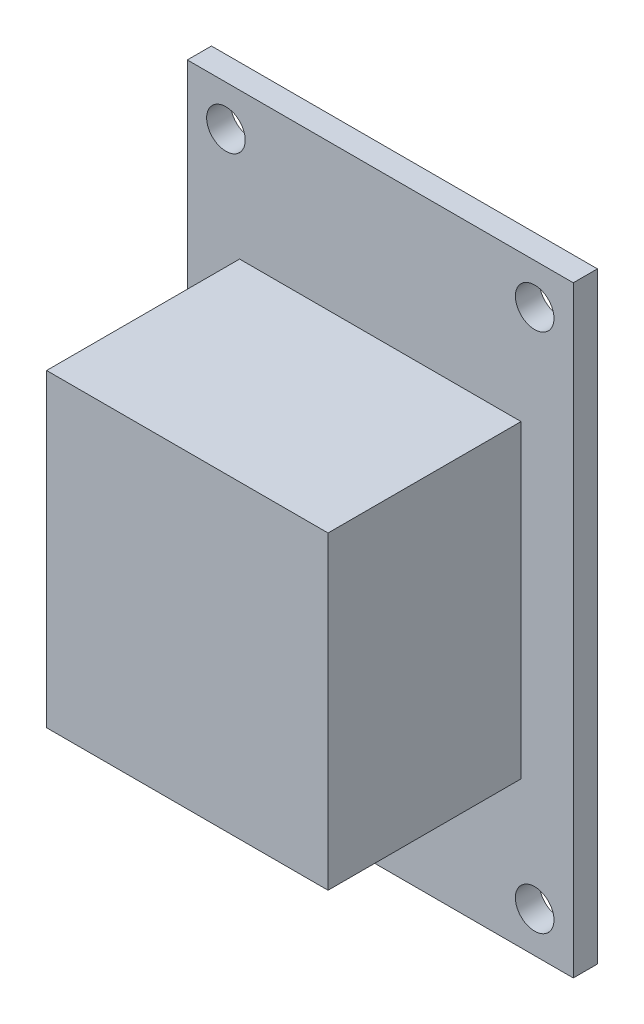
ISO-10303-21;
HEADER;
FILE_DESCRIPTION(('STEP AP214'),'2;1');
FILE_NAME('part.step','',(''),(''),'','','');
FILE_SCHEMA(('AUTOMOTIVE_DESIGN { 1 0 10303 214 1 1 1 1 }'));
ENDSEC;
DATA;
#1=APPLICATION_CONTEXT('core data for automotive mechanical design processes');
#2=APPLICATION_PROTOCOL_DEFINITION('international standard','automotive_design',2000,#1);
#3=PRODUCT_CONTEXT('',#1,'mechanical');
#4=PRODUCT('Part','Part','',(#3));
#5=PRODUCT_RELATED_PRODUCT_CATEGORY('part','',(#4));
#6=PRODUCT_DEFINITION_FORMATION('','',#4);
#7=PRODUCT_DEFINITION_CONTEXT('part definition',#1,'design');
#8=PRODUCT_DEFINITION('design','',#6,#7);
#9=PRODUCT_DEFINITION_SHAPE('','',#8);
#10=(LENGTH_UNIT() NAMED_UNIT(*) SI_UNIT(.MILLI.,.METRE.));
#11=(NAMED_UNIT(*) PLANE_ANGLE_UNIT() SI_UNIT($,.RADIAN.));
#12=(NAMED_UNIT(*) SI_UNIT($,.STERADIAN.) SOLID_ANGLE_UNIT());
#13=UNCERTAINTY_MEASURE_WITH_UNIT(LENGTH_MEASURE(1.E-05),#10,'distance_accuracy_value','');
#14=(GEOMETRIC_REPRESENTATION_CONTEXT(3) GLOBAL_UNCERTAINTY_ASSIGNED_CONTEXT((#13)) GLOBAL_UNIT_ASSIGNED_CONTEXT((#10,
#11,#12)) REPRESENTATION_CONTEXT('',''));
#15=CARTESIAN_POINT('',(0.,0.,0.));
#16=DIRECTION('',(0.,0.,1.));
#17=DIRECTION('',(1.,0.,0.));
#18=AXIS2_PLACEMENT_3D('',#15,#16,#17);
#19=CARTESIAN_POINT('',(12.7,19.812,1.5875));
#20=DIRECTION('',(-1.,0.,0.));
#21=DIRECTION('',(0.,-1.,0.));
#22=AXIS2_PLACEMENT_3D('',#19,#20,#21);
#23=PLANE('',#22);
#24=DIRECTION('',(0.,1.,0.));
#25=VECTOR('',#24,1.);
#26=CARTESIAN_POINT('',(12.7,19.812,0.));
#27=LINE('',#26,#25);
#28=CARTESIAN_POINT('',(12.7,-19.812,0.));
#29=VERTEX_POINT('',#28);
#30=CARTESIAN_POINT('',(12.7,19.812,0.));
#31=VERTEX_POINT('',#30);
#32=EDGE_CURVE('E126',#29,#31,#27,.T.);
#33=ORIENTED_EDGE('',*,*,#32,.T.);
#34=DIRECTION('',(0.,0.,-1.));
#35=VECTOR('',#34,1.);
#36=CARTESIAN_POINT('',(12.7,19.812,1.5875));
#37=LINE('',#36,#35);
#38=CARTESIAN_POINT('',(12.7,19.812,1.5875));
#39=VERTEX_POINT('',#38);
#40=EDGE_CURVE('E11',#39,#31,#37,.T.);
#41=ORIENTED_EDGE('',*,*,#40,.F.);
#42=DIRECTION('',(0.,1.,0.));
#43=VECTOR('',#42,1.);
#44=CARTESIAN_POINT('',(12.7,19.812,1.5875));
#45=LINE('',#44,#43);
#46=CARTESIAN_POINT('',(12.7,-19.812,1.5875));
#47=VERTEX_POINT('',#46);
#48=EDGE_CURVE('E137',#47,#39,#45,.T.);
#49=ORIENTED_EDGE('',*,*,#48,.F.);
#50=DIRECTION('',(0.,0.,-1.));
#51=VECTOR('',#50,1.);
#52=CARTESIAN_POINT('',(12.7,-19.812,1.5875));
#53=LINE('',#52,#51);
#54=EDGE_CURVE('E150',#47,#29,#53,.T.);
#55=ORIENTED_EDGE('',*,*,#54,.T.);
#56=EDGE_LOOP('',(#33,#41,#49,#55));
#57=FACE_BOUND('',#56,.T.);
#58=ADVANCED_FACE('F38',(#57),#23,.F.);
#59=CARTESIAN_POINT('',(-12.7,19.812,1.5875));
#60=DIRECTION('',(0.,-1.,0.));
#61=DIRECTION('',(0.,0.,-1.));
#62=AXIS2_PLACEMENT_3D('',#59,#60,#61);
#63=PLANE('',#62);
#64=DIRECTION('',(-1.,0.,0.));
#65=VECTOR('',#64,1.);
#66=CARTESIAN_POINT('',(-12.7,19.812,0.));
#67=LINE('',#66,#65);
#68=CARTESIAN_POINT('',(-12.7,19.812,0.));
#69=VERTEX_POINT('',#68);
#70=EDGE_CURVE('E131',#31,#69,#67,.T.);
#71=ORIENTED_EDGE('',*,*,#70,.T.);
#72=DIRECTION('',(0.,0.,-1.));
#73=VECTOR('',#72,1.);
#74=CARTESIAN_POINT('',(-12.7,19.812,1.5875));
#75=LINE('',#74,#73);
#76=CARTESIAN_POINT('',(-12.7,19.812,1.5875));
#77=VERTEX_POINT('',#76);
#78=EDGE_CURVE('E46',#77,#69,#75,.T.);
#79=ORIENTED_EDGE('',*,*,#78,.F.);
#80=DIRECTION('',(-1.,0.,0.));
#81=VECTOR('',#80,1.);
#82=CARTESIAN_POINT('',(-12.7,19.812,1.5875));
#83=LINE('',#82,#81);
#84=EDGE_CURVE('E141',#39,#77,#83,.T.);
#85=ORIENTED_EDGE('',*,*,#84,.F.);
#86=ORIENTED_EDGE('',*,*,#40,.T.);
#87=EDGE_LOOP('',(#71,#79,#85,#86));
#88=FACE_BOUND('',#87,.T.);
#89=ADVANCED_FACE('F187',(#88),#63,.F.);
#90=CARTESIAN_POINT('',(-12.7,19.812,1.5875));
#91=DIRECTION('',(1.,0.,0.));
#92=DIRECTION('',(0.,1.,0.));
#93=AXIS2_PLACEMENT_3D('',#90,#91,#92);
#94=PLANE('',#93);
#95=DIRECTION('',(0.,-1.,0.));
#96=VECTOR('',#95,1.);
#97=CARTESIAN_POINT('',(-12.7,19.812,0.));
#98=LINE('',#97,#96);
#99=CARTESIAN_POINT('',(-12.7,-19.812,0.));
#100=VERTEX_POINT('',#99);
#101=EDGE_CURVE('E154',#69,#100,#98,.T.);
#102=ORIENTED_EDGE('',*,*,#101,.T.);
#103=DIRECTION('',(0.,0.,-1.));
#104=VECTOR('',#103,1.);
#105=CARTESIAN_POINT('',(-12.7,-19.812,1.5875));
#106=LINE('',#105,#104);
#107=CARTESIAN_POINT('',(-12.7,-19.812,1.5875));
#108=VERTEX_POINT('',#107);
#109=EDGE_CURVE('E162',#108,#100,#106,.T.);
#110=ORIENTED_EDGE('',*,*,#109,.F.);
#111=DIRECTION('',(0.,-1.,0.));
#112=VECTOR('',#111,1.);
#113=CARTESIAN_POINT('',(-12.7,19.812,1.5875));
#114=LINE('',#113,#112);
#115=EDGE_CURVE('E145',#77,#108,#114,.T.);
#116=ORIENTED_EDGE('',*,*,#115,.F.);
#117=ORIENTED_EDGE('',*,*,#78,.T.);
#118=EDGE_LOOP('',(#102,#110,#116,#117));
#119=FACE_BOUND('',#118,.T.);
#120=ADVANCED_FACE('F171',(#119),#94,.F.);
#121=CARTESIAN_POINT('',(-12.7,-19.812,1.5875));
#122=DIRECTION('',(0.,1.,0.));
#123=DIRECTION('',(0.,0.,1.));
#124=AXIS2_PLACEMENT_3D('',#121,#122,#123);
#125=PLANE('',#124);
#126=DIRECTION('',(1.,0.,0.));
#127=VECTOR('',#126,1.);
#128=CARTESIAN_POINT('',(-12.7,-19.812,0.));
#129=LINE('',#128,#127);
#130=EDGE_CURVE('E142',#100,#29,#129,.T.);
#131=ORIENTED_EDGE('',*,*,#130,.T.);
#132=ORIENTED_EDGE('',*,*,#54,.F.);
#133=DIRECTION('',(1.,0.,0.));
#134=VECTOR('',#133,1.);
#135=CARTESIAN_POINT('',(-12.7,-19.812,1.5875));
#136=LINE('',#135,#134);
#137=EDGE_CURVE('E148',#108,#47,#136,.T.);
#138=ORIENTED_EDGE('',*,*,#137,.F.);
#139=ORIENTED_EDGE('',*,*,#109,.T.);
#140=EDGE_LOOP('',(#131,#132,#138,#139));
#141=FACE_BOUND('',#140,.T.);
#142=ADVANCED_FACE('F180',(#141),#125,.F.);
#143=CARTESIAN_POINT('',(0.,0.,1.5875));
#144=DIRECTION('',(0.,0.,1.));
#145=DIRECTION('',(1.,0.,0.));
#146=AXIS2_PLACEMENT_3D('',#143,#144,#145);
#147=PLANE('',#146);
#148=CARTESIAN_POINT('',(-10.16,-17.145,1.5875));
#149=DIRECTION('',(0.,0.,1.));
#150=DIRECTION('',(1.,0.,0.));
#151=AXIS2_PLACEMENT_3D('',#148,#149,#150);
#152=CIRCLE('',#151,1.27);
#153=CARTESIAN_POINT('',(-8.89,-17.145,1.5875));
#154=VERTEX_POINT('',#153);
#155=EDGE_CURVE('E260',#154,#154,#152,.T.);
#156=ORIENTED_EDGE('',*,*,#155,.F.);
#157=EDGE_LOOP('',(#156));
#158=FACE_BOUND('',#157,.T.);
#159=CARTESIAN_POINT('',(10.16,-17.145,1.5875));
#160=DIRECTION('',(0.,0.,1.));
#161=DIRECTION('',(1.,0.,0.));
#162=AXIS2_PLACEMENT_3D('',#159,#160,#161);
#163=CIRCLE('',#162,1.27);
#164=CARTESIAN_POINT('',(11.43,-17.145,1.5875));
#165=VERTEX_POINT('',#164);
#166=EDGE_CURVE('E250',#165,#165,#163,.T.);
#167=ORIENTED_EDGE('',*,*,#166,.F.);
#168=EDGE_LOOP('',(#167));
#169=FACE_BOUND('',#168,.T.);
#170=CARTESIAN_POINT('',(10.16,17.145,1.5875));
#171=DIRECTION('',(0.,0.,1.));
#172=DIRECTION('',(1.,0.,0.));
#173=AXIS2_PLACEMENT_3D('',#170,#171,#172);
#174=CIRCLE('',#173,1.27);
#175=CARTESIAN_POINT('',(11.43,17.145,1.5875));
#176=VERTEX_POINT('',#175);
#177=EDGE_CURVE('E240',#176,#176,#174,.T.);
#178=ORIENTED_EDGE('',*,*,#177,.F.);
#179=EDGE_LOOP('',(#178));
#180=FACE_BOUND('',#179,.T.);
#181=CARTESIAN_POINT('',(-10.16,17.145,1.5875));
#182=DIRECTION('',(0.,0.,1.));
#183=DIRECTION('',(1.,0.,0.));
#184=AXIS2_PLACEMENT_3D('',#181,#182,#183);
#185=CIRCLE('',#184,1.27);
#186=CARTESIAN_POINT('',(-8.89,17.145,1.5875));
#187=VERTEX_POINT('',#186);
#188=EDGE_CURVE('E247',#187,#187,#185,.T.);
#189=ORIENTED_EDGE('',*,*,#188,.F.);
#190=EDGE_LOOP('',(#189));
#191=FACE_BOUND('',#190,.T.);
#192=DIRECTION('',(0.,1.,0.));
#193=VECTOR('',#192,1.);
#194=CARTESIAN_POINT('',(9.26125385405961,10.1821171634121,1.5875));
#195=LINE('',#194,#193);
#196=CARTESIAN_POINT('',(9.26125385405961,-10.1821171634121,1.5875));
#197=VERTEX_POINT('',#196);
#198=CARTESIAN_POINT('',(9.26125385405961,10.1821171634121,1.5875));
#199=VERTEX_POINT('',#198);
#200=EDGE_CURVE('E53',#197,#199,#195,.T.);
#201=ORIENTED_EDGE('',*,*,#200,.F.);
#202=DIRECTION('',(1.,0.,0.));
#203=VECTOR('',#202,1.);
#204=CARTESIAN_POINT('',(-9.26125385405961,-10.1821171634121,1.5875));
#205=LINE('',#204,#203);
#206=CARTESIAN_POINT('',(-9.26125385405961,-10.1821171634121,1.5875));
#207=VERTEX_POINT('',#206);
#208=EDGE_CURVE('E57',#207,#197,#205,.T.);
#209=ORIENTED_EDGE('',*,*,#208,.F.);
#210=DIRECTION('',(0.,-1.,0.));
#211=VECTOR('',#210,1.);
#212=CARTESIAN_POINT('',(-9.26125385405961,10.1821171634121,1.5875));
#213=LINE('',#212,#211);
#214=CARTESIAN_POINT('',(-9.26125385405961,10.1821171634121,1.5875));
#215=VERTEX_POINT('',#214);
#216=EDGE_CURVE('E281',#215,#207,#213,.T.);
#217=ORIENTED_EDGE('',*,*,#216,.F.);
#218=DIRECTION('',(-1.,0.,0.));
#219=VECTOR('',#218,1.);
#220=CARTESIAN_POINT('',(-9.26125385405961,10.1821171634121,1.5875));
#221=LINE('',#220,#219);
#222=EDGE_CURVE('E278',#199,#215,#221,.T.);
#223=ORIENTED_EDGE('',*,*,#222,.F.);
#224=EDGE_LOOP('',(#201,#209,#217,#223));
#225=FACE_BOUND('',#224,.T.);
#226=ORIENTED_EDGE('',*,*,#48,.T.);
#227=ORIENTED_EDGE('',*,*,#84,.T.);
#228=ORIENTED_EDGE('',*,*,#115,.T.);
#229=ORIENTED_EDGE('',*,*,#137,.T.);
#230=EDGE_LOOP('',(#226,#227,#228,#229));
#231=FACE_BOUND('',#230,.T.);
#232=ADVANCED_FACE('F186',(#158,#169,#180,#191,#225,#231),#147,.T.);
#233=CARTESIAN_POINT('',(0.,0.,0.));
#234=DIRECTION('',(0.,0.,1.));
#235=DIRECTION('',(1.,0.,0.));
#236=AXIS2_PLACEMENT_3D('',#233,#234,#235);
#237=PLANE('',#236);
#238=CARTESIAN_POINT('',(-10.16,-17.145,0.));
#239=DIRECTION('',(0.,0.,1.));
#240=DIRECTION('',(1.,0.,0.));
#241=AXIS2_PLACEMENT_3D('',#238,#239,#240);
#242=CIRCLE('',#241,1.27);
#243=CARTESIAN_POINT('',(-8.89,-17.145,0.));
#244=VERTEX_POINT('',#243);
#245=EDGE_CURVE('E256',#244,#244,#242,.T.);
#246=ORIENTED_EDGE('',*,*,#245,.T.);
#247=EDGE_LOOP('',(#246));
#248=FACE_BOUND('',#247,.T.);
#249=CARTESIAN_POINT('',(10.16,-17.145,0.));
#250=DIRECTION('',(0.,0.,1.));
#251=DIRECTION('',(1.,0.,0.));
#252=AXIS2_PLACEMENT_3D('',#249,#250,#251);
#253=CIRCLE('',#252,1.27);
#254=CARTESIAN_POINT('',(11.43,-17.145,0.));
#255=VERTEX_POINT('',#254);
#256=EDGE_CURVE('E243',#255,#255,#253,.T.);
#257=ORIENTED_EDGE('',*,*,#256,.T.);
#258=EDGE_LOOP('',(#257));
#259=FACE_BOUND('',#258,.T.);
#260=CARTESIAN_POINT('',(10.16,17.145,0.));
#261=DIRECTION('',(0.,0.,1.));
#262=DIRECTION('',(1.,0.,0.));
#263=AXIS2_PLACEMENT_3D('',#260,#261,#262);
#264=CIRCLE('',#263,1.27);
#265=CARTESIAN_POINT('',(11.43,17.145,0.));
#266=VERTEX_POINT('',#265);
#267=EDGE_CURVE('E237',#266,#266,#264,.T.);
#268=ORIENTED_EDGE('',*,*,#267,.T.);
#269=EDGE_LOOP('',(#268));
#270=FACE_BOUND('',#269,.T.);
#271=CARTESIAN_POINT('',(-10.16,17.145,0.));
#272=DIRECTION('',(0.,0.,1.));
#273=DIRECTION('',(1.,0.,0.));
#274=AXIS2_PLACEMENT_3D('',#271,#272,#273);
#275=CIRCLE('',#274,1.27);
#276=CARTESIAN_POINT('',(-8.89,17.145,0.));
#277=VERTEX_POINT('',#276);
#278=EDGE_CURVE('E264',#277,#277,#275,.T.);
#279=ORIENTED_EDGE('',*,*,#278,.T.);
#280=EDGE_LOOP('',(#279));
#281=FACE_BOUND('',#280,.T.);
#282=ORIENTED_EDGE('',*,*,#32,.F.);
#283=ORIENTED_EDGE('',*,*,#130,.F.);
#284=ORIENTED_EDGE('',*,*,#101,.F.);
#285=ORIENTED_EDGE('',*,*,#70,.F.);
#286=EDGE_LOOP('',(#282,#283,#284,#285));
#287=FACE_BOUND('',#286,.T.);
#288=ADVANCED_FACE('F177',(#248,#259,#270,#281,#287),#237,.F.);
#289=CARTESIAN_POINT('',(9.26125385405961,10.1821171634121,14.2875));
#290=DIRECTION('',(-1.,0.,0.));
#291=DIRECTION('',(0.,0.,1.));
#292=AXIS2_PLACEMENT_3D('',#289,#290,#291);
#293=PLANE('',#292);
#294=ORIENTED_EDGE('',*,*,#200,.T.);
#295=DIRECTION('',(0.,0.,-1.));
#296=VECTOR('',#295,1.);
#297=CARTESIAN_POINT('',(9.26125385405961,10.1821171634121,14.2875));
#298=LINE('',#297,#296);
#299=CARTESIAN_POINT('',(9.26125385405961,10.1821171634121,14.2875));
#300=VERTEX_POINT('',#299);
#301=EDGE_CURVE('E106',#300,#199,#298,.T.);
#302=ORIENTED_EDGE('',*,*,#301,.F.);
#303=DIRECTION('',(0.,1.,0.));
#304=VECTOR('',#303,1.);
#305=CARTESIAN_POINT('',(9.26125385405961,10.1821171634121,14.2875));
#306=LINE('',#305,#304);
#307=CARTESIAN_POINT('',(9.26125385405961,-10.1821171634121,14.2875));
#308=VERTEX_POINT('',#307);
#309=EDGE_CURVE('E113',#308,#300,#306,.T.);
#310=ORIENTED_EDGE('',*,*,#309,.F.);
#311=DIRECTION('',(0.,0.,-1.));
#312=VECTOR('',#311,1.);
#313=CARTESIAN_POINT('',(9.26125385405961,-10.1821171634121,14.2875));
#314=LINE('',#313,#312);
#315=EDGE_CURVE('E275',#308,#197,#314,.T.);
#316=ORIENTED_EDGE('',*,*,#315,.T.);
#317=EDGE_LOOP('',(#294,#302,#310,#316));
#318=FACE_BOUND('',#317,.T.);
#319=ADVANCED_FACE('F124',(#318),#293,.F.);
#320=CARTESIAN_POINT('',(-9.26125385405961,10.1821171634121,14.2875));
#321=DIRECTION('',(0.,-1.,0.));
#322=DIRECTION('',(0.,0.,-1.));
#323=AXIS2_PLACEMENT_3D('',#320,#321,#322);
#324=PLANE('',#323);
#325=ORIENTED_EDGE('',*,*,#222,.T.);
#326=DIRECTION('',(0.,0.,-1.));
#327=VECTOR('',#326,1.);
#328=CARTESIAN_POINT('',(-9.26125385405961,10.1821171634121,14.2875));
#329=LINE('',#328,#327);
#330=CARTESIAN_POINT('',(-9.26125385405961,10.1821171634121,14.2875));
#331=VERTEX_POINT('',#330);
#332=EDGE_CURVE('E108',#331,#215,#329,.T.);
#333=ORIENTED_EDGE('',*,*,#332,.F.);
#334=DIRECTION('',(-1.,0.,0.));
#335=VECTOR('',#334,1.);
#336=CARTESIAN_POINT('',(-9.26125385405961,10.1821171634121,14.2875));
#337=LINE('',#336,#335);
#338=EDGE_CURVE('E101',#300,#331,#337,.T.);
#339=ORIENTED_EDGE('',*,*,#338,.F.);
#340=ORIENTED_EDGE('',*,*,#301,.T.);
#341=EDGE_LOOP('',(#325,#333,#339,#340));
#342=FACE_BOUND('',#341,.T.);
#343=ADVANCED_FACE('F104',(#342),#324,.F.);
#344=CARTESIAN_POINT('',(-9.26125385405961,10.1821171634121,14.2875));
#345=DIRECTION('',(1.,0.,0.));
#346=DIRECTION('',(0.,0.,-1.));
#347=AXIS2_PLACEMENT_3D('',#344,#345,#346);
#348=PLANE('',#347);
#349=ORIENTED_EDGE('',*,*,#216,.T.);
#350=DIRECTION('',(0.,0.,-1.));
#351=VECTOR('',#350,1.);
#352=CARTESIAN_POINT('',(-9.26125385405961,-10.1821171634121,14.2875));
#353=LINE('',#352,#351);
#354=CARTESIAN_POINT('',(-9.26125385405961,-10.1821171634121,14.2875));
#355=VERTEX_POINT('',#354);
#356=EDGE_CURVE('E133',#355,#207,#353,.T.);
#357=ORIENTED_EDGE('',*,*,#356,.F.);
#358=DIRECTION('',(0.,-1.,0.));
#359=VECTOR('',#358,1.);
#360=CARTESIAN_POINT('',(-9.26125385405961,10.1821171634121,14.2875));
#361=LINE('',#360,#359);
#362=EDGE_CURVE('E112',#331,#355,#361,.T.);
#363=ORIENTED_EDGE('',*,*,#362,.F.);
#364=ORIENTED_EDGE('',*,*,#332,.T.);
#365=EDGE_LOOP('',(#349,#357,#363,#364));
#366=FACE_BOUND('',#365,.T.);
#367=ADVANCED_FACE('F207',(#366),#348,.F.);
#368=CARTESIAN_POINT('',(-9.26125385405961,-10.1821171634121,14.2875));
#369=DIRECTION('',(0.,1.,0.));
#370=DIRECTION('',(0.,0.,1.));
#371=AXIS2_PLACEMENT_3D('',#368,#369,#370);
#372=PLANE('',#371);
#373=ORIENTED_EDGE('',*,*,#208,.T.);
#374=ORIENTED_EDGE('',*,*,#315,.F.);
#375=DIRECTION('',(1.,0.,0.));
#376=VECTOR('',#375,1.);
#377=CARTESIAN_POINT('',(-9.26125385405961,-10.1821171634121,14.2875));
#378=LINE('',#377,#376);
#379=EDGE_CURVE('E118',#355,#308,#378,.T.);
#380=ORIENTED_EDGE('',*,*,#379,.F.);
#381=ORIENTED_EDGE('',*,*,#356,.T.);
#382=EDGE_LOOP('',(#373,#374,#380,#381));
#383=FACE_BOUND('',#382,.T.);
#384=ADVANCED_FACE('F210',(#383),#372,.F.);
#385=CARTESIAN_POINT('',(0.,0.,14.2875));
#386=DIRECTION('',(0.,0.,1.));
#387=DIRECTION('',(1.,0.,0.));
#388=AXIS2_PLACEMENT_3D('',#385,#386,#387);
#389=PLANE('',#388);
#390=ORIENTED_EDGE('',*,*,#309,.T.);
#391=ORIENTED_EDGE('',*,*,#338,.T.);
#392=ORIENTED_EDGE('',*,*,#362,.T.);
#393=ORIENTED_EDGE('',*,*,#379,.T.);
#394=EDGE_LOOP('',(#390,#391,#392,#393));
#395=FACE_BOUND('',#394,.T.);
#396=ADVANCED_FACE('F116',(#395),#389,.T.);
#397=CARTESIAN_POINT('',(-10.16,17.145,0.));
#398=DIRECTION('',(0.,0.,1.));
#399=DIRECTION('',(1.,0.,0.));
#400=AXIS2_PLACEMENT_3D('',#397,#398,#399);
#401=CYLINDRICAL_SURFACE('',#400,1.27);
#402=ORIENTED_EDGE('',*,*,#278,.F.);
#403=EDGE_LOOP('',(#402));
#404=FACE_BOUND('',#403,.T.);
#405=ORIENTED_EDGE('',*,*,#188,.T.);
#406=EDGE_LOOP('',(#405));
#407=FACE_BOUND('',#406,.T.);
#408=ADVANCED_FACE('F217',(#404,#407),#401,.F.);
#409=CARTESIAN_POINT('',(10.16,17.145,0.));
#410=DIRECTION('',(0.,0.,1.));
#411=DIRECTION('',(1.,0.,0.));
#412=AXIS2_PLACEMENT_3D('',#409,#410,#411);
#413=CYLINDRICAL_SURFACE('',#412,1.27);
#414=ORIENTED_EDGE('',*,*,#267,.F.);
#415=EDGE_LOOP('',(#414));
#416=FACE_BOUND('',#415,.T.);
#417=ORIENTED_EDGE('',*,*,#177,.T.);
#418=EDGE_LOOP('',(#417));
#419=FACE_BOUND('',#418,.T.);
#420=ADVANCED_FACE('F220',(#416,#419),#413,.F.);
#421=CARTESIAN_POINT('',(10.16,-17.145,0.));
#422=DIRECTION('',(0.,0.,1.));
#423=DIRECTION('',(1.,0.,0.));
#424=AXIS2_PLACEMENT_3D('',#421,#422,#423);
#425=CYLINDRICAL_SURFACE('',#424,1.27);
#426=ORIENTED_EDGE('',*,*,#256,.F.);
#427=EDGE_LOOP('',(#426));
#428=FACE_BOUND('',#427,.T.);
#429=ORIENTED_EDGE('',*,*,#166,.T.);
#430=EDGE_LOOP('',(#429));
#431=FACE_BOUND('',#430,.T.);
#432=ADVANCED_FACE('F225',(#428,#431),#425,.F.);
#433=CARTESIAN_POINT('',(-10.16,-17.145,0.));
#434=DIRECTION('',(0.,0.,1.));
#435=DIRECTION('',(1.,0.,0.));
#436=AXIS2_PLACEMENT_3D('',#433,#434,#435);
#437=CYLINDRICAL_SURFACE('',#436,1.27);
#438=ORIENTED_EDGE('',*,*,#245,.F.);
#439=EDGE_LOOP('',(#438));
#440=FACE_BOUND('',#439,.T.);
#441=ORIENTED_EDGE('',*,*,#155,.T.);
#442=EDGE_LOOP('',(#441));
#443=FACE_BOUND('',#442,.T.);
#444=ADVANCED_FACE('F222',(#440,#443),#437,.F.);
#445=CLOSED_SHELL('',(#58,#89,#120,#142,#232,#288,#319,#343,#367,#384,#396,#408,#420,#432,#444));
#446=MANIFOLD_SOLID_BREP('B2',#445);
#447=ADVANCED_BREP_SHAPE_REPRESENTATION('',(#18,#446),#14);
#448=SHAPE_DEFINITION_REPRESENTATION(#9,#447);
ENDSEC;
END-ISO-10303-21;
